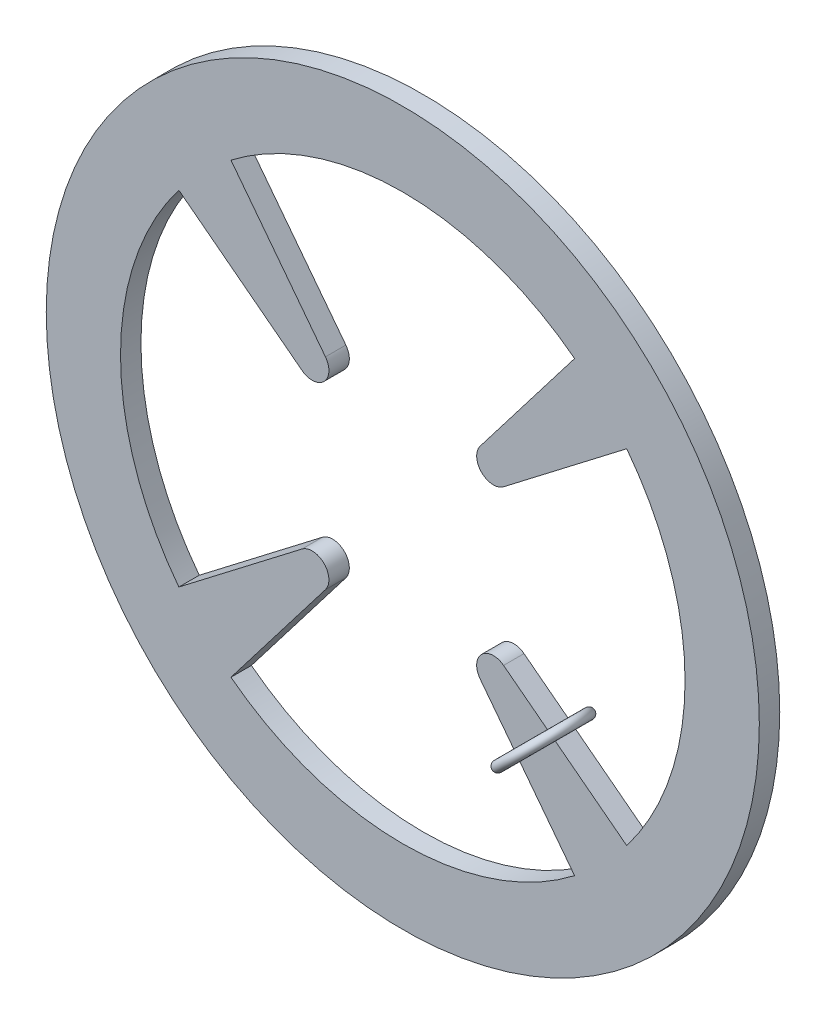
ISO-10303-21;
HEADER;
FILE_DESCRIPTION(('STEP AP214'),'2;1');
FILE_NAME('part.step','',(''),(''),'','','');
FILE_SCHEMA(('AUTOMOTIVE_DESIGN { 1 0 10303 214 1 1 1 1 }'));
ENDSEC;
DATA;
#1=APPLICATION_CONTEXT('core data for automotive mechanical design processes');
#2=APPLICATION_PROTOCOL_DEFINITION('international standard','automotive_design',2000,#1);
#3=PRODUCT_CONTEXT('',#1,'mechanical');
#4=PRODUCT('Part','Part','',(#3));
#5=PRODUCT_RELATED_PRODUCT_CATEGORY('part','',(#4));
#6=PRODUCT_DEFINITION_FORMATION('','',#4);
#7=PRODUCT_DEFINITION_CONTEXT('part definition',#1,'design');
#8=PRODUCT_DEFINITION('design','',#6,#7);
#9=PRODUCT_DEFINITION_SHAPE('','',#8);
#10=(LENGTH_UNIT() NAMED_UNIT(*) SI_UNIT(.MILLI.,.METRE.));
#11=(NAMED_UNIT(*) PLANE_ANGLE_UNIT() SI_UNIT($,.RADIAN.));
#12=(NAMED_UNIT(*) SI_UNIT($,.STERADIAN.) SOLID_ANGLE_UNIT());
#13=UNCERTAINTY_MEASURE_WITH_UNIT(LENGTH_MEASURE(1.E-05),#10,'distance_accuracy_value','');
#14=(GEOMETRIC_REPRESENTATION_CONTEXT(3) GLOBAL_UNCERTAINTY_ASSIGNED_CONTEXT((#13)) GLOBAL_UNIT_ASSIGNED_CONTEXT((#10,
#11,#12)) REPRESENTATION_CONTEXT('',''));
#15=CARTESIAN_POINT('',(0.,0.,0.));
#16=DIRECTION('',(0.,0.,1.));
#17=DIRECTION('',(1.,0.,0.));
#18=AXIS2_PLACEMENT_3D('',#15,#16,#17);
#19=CARTESIAN_POINT('',(0.353553390593274,-0.35355339059327,0.03));
#20=DIRECTION('',(0.707106781186549,-0.707106781186546,0.));
#21=DIRECTION('',(0.707106781186546,0.707106781186549,0.));
#22=AXIS2_PLACEMENT_3D('',#19,#20,#21);
#23=TOROIDAL_SURFACE('',#22,0.1,0.0132);
#24=CARTESIAN_POINT('',(0.424264068711928,-0.282842712474616,0.03));
#25=DIRECTION('',(0.,0.,1.));
#26=DIRECTION('',(1.,0.,0.));
#27=AXIS2_PLACEMENT_3D('',#24,#25,#26);
#28=CIRCLE('',#27,0.0132);
#29=CARTESIAN_POINT('',(0.433597878223591,-0.273508902962953,0.03));
#30=VERTEX_POINT('',#29);
#31=EDGE_CURVE('E11',#30,#30,#28,.T.);
#32=CARTESIAN_POINT('',(0.353553390593274,-0.35355339059327,0.03));
#33=DIRECTION('',(0.707106781186549,-0.707106781186546,0.));
#34=DIRECTION('',(0.707106781186546,0.707106781186549,0.));
#35=AXIS2_PLACEMENT_3D('',#32,#33,#34);
#36=CIRCLE('',#35,0.1132);
#37=EDGE_CURVE('',#30,#30,#36,.T.);
#38=ORIENTED_EDGE('',*,*,#31,.T.);
#39=ORIENTED_EDGE('',*,*,#31,.F.);
#40=ORIENTED_EDGE('',*,*,#37,.T.);
#41=ORIENTED_EDGE('',*,*,#37,.F.);
#42=EDGE_LOOP('',(#38,#40,#39,#41));
#43=FACE_BOUND('',#42,.T.);
#44=ADVANCED_FACE('F55',(#43),#23,.T.);
#45=CLOSED_SHELL('',(#44));
#46=MANIFOLD_SOLID_BREP('B2',#45);
#47=CARTESIAN_POINT('',(0.,0.,0.055));
#48=DIRECTION('',(0.,0.,-1.));
#49=DIRECTION('',(-1.,0.,0.));
#50=AXIS2_PLACEMENT_3D('',#47,#48,#49);
#51=CYLINDRICAL_SURFACE('',#50,0.76);
#52=CARTESIAN_POINT('',(0.,0.,0.));
#53=DIRECTION('',(0.,0.,1.));
#54=DIRECTION('',(1.,0.,0.));
#55=AXIS2_PLACEMENT_3D('',#52,#53,#54);
#56=CIRCLE('',#55,0.76);
#57=CARTESIAN_POINT('',(-0.462658686046631,-0.602948538621336,0.));
#58=VERTEX_POINT('',#57);
#59=CARTESIAN_POINT('',(0.462658686046628,-0.602948538621339,0.));
#60=VERTEX_POINT('',#59);
#61=EDGE_CURVE('E350',#58,#60,#56,.T.);
#62=ORIENTED_EDGE('',*,*,#61,.F.);
#63=DIRECTION('',(0.,0.,1.));
#64=VECTOR('',#63,1.);
#65=CARTESIAN_POINT('',(-0.462658686046631,-0.602948538621336,0.));
#66=LINE('',#65,#64);
#67=CARTESIAN_POINT('',(-0.462658686046631,-0.602948538621336,0.055));
#68=VERTEX_POINT('',#67);
#69=EDGE_CURVE('E90',#58,#68,#66,.T.);
#70=ORIENTED_EDGE('',*,*,#69,.T.);
#71=CARTESIAN_POINT('',(0.,0.,0.055));
#72=DIRECTION('',(0.,0.,1.));
#73=DIRECTION('',(1.,0.,0.));
#74=AXIS2_PLACEMENT_3D('',#71,#72,#73);
#75=CIRCLE('',#74,0.76);
#76=CARTESIAN_POINT('',(0.462658686046628,-0.602948538621339,0.055));
#77=VERTEX_POINT('',#76);
#78=EDGE_CURVE('E347',#68,#77,#75,.T.);
#79=ORIENTED_EDGE('',*,*,#78,.T.);
#80=DIRECTION('',(0.,0.,1.));
#81=VECTOR('',#80,1.);
#82=CARTESIAN_POINT('',(0.462658686046628,-0.602948538621339,0.));
#83=LINE('',#82,#81);
#84=EDGE_CURVE('E260',#60,#77,#83,.T.);
#85=ORIENTED_EDGE('',*,*,#84,.F.);
#86=EDGE_LOOP('',(#62,#70,#79,#85));
#87=FACE_BOUND('',#86,.T.);
#88=ADVANCED_FACE('F74',(#87),#51,.F.);
#89=CARTESIAN_POINT('',(0.602948538621336,-0.462658686046631,0.));
#90=VERTEX_POINT('',#89);
#91=CARTESIAN_POINT('',(0.602948538621339,0.462658686046628,0.));
#92=VERTEX_POINT('',#91);
#93=EDGE_CURVE('E354',#90,#92,#56,.T.);
#94=ORIENTED_EDGE('',*,*,#93,.F.);
#95=DIRECTION('',(0.,0.,1.));
#96=VECTOR('',#95,1.);
#97=CARTESIAN_POINT('',(0.602948538621336,-0.462658686046631,0.));
#98=LINE('',#97,#96);
#99=CARTESIAN_POINT('',(0.602948538621336,-0.462658686046631,0.055));
#100=VERTEX_POINT('',#99);
#101=EDGE_CURVE('E98',#90,#100,#98,.T.);
#102=ORIENTED_EDGE('',*,*,#101,.T.);
#103=CARTESIAN_POINT('',(0.602948538621339,0.462658686046628,0.055));
#104=VERTEX_POINT('',#103);
#105=EDGE_CURVE('E353',#100,#104,#75,.T.);
#106=ORIENTED_EDGE('',*,*,#105,.T.);
#107=DIRECTION('',(0.,0.,1.));
#108=VECTOR('',#107,1.);
#109=CARTESIAN_POINT('',(0.602948538621339,0.462658686046628,0.));
#110=LINE('',#109,#108);
#111=EDGE_CURVE('E297',#92,#104,#110,.T.);
#112=ORIENTED_EDGE('',*,*,#111,.F.);
#113=EDGE_LOOP('',(#94,#102,#106,#112));
#114=FACE_BOUND('',#113,.T.);
#115=ADVANCED_FACE('F369',(#114),#51,.F.);
#116=CARTESIAN_POINT('',(0.462658686046631,0.602948538621336,0.));
#117=VERTEX_POINT('',#116);
#118=CARTESIAN_POINT('',(-0.462658686046628,0.602948538621339,0.));
#119=VERTEX_POINT('',#118);
#120=EDGE_CURVE('E333',#117,#119,#56,.T.);
#121=ORIENTED_EDGE('',*,*,#120,.F.);
#122=DIRECTION('',(0.,0.,1.));
#123=VECTOR('',#122,1.);
#124=CARTESIAN_POINT('',(0.462658686046631,0.602948538621336,0.));
#125=LINE('',#124,#123);
#126=CARTESIAN_POINT('',(0.462658686046631,0.602948538621336,0.055));
#127=VERTEX_POINT('',#126);
#128=EDGE_CURVE('E292',#117,#127,#125,.T.);
#129=ORIENTED_EDGE('',*,*,#128,.T.);
#130=CARTESIAN_POINT('',(-0.462658686046628,0.602948538621339,0.055));
#131=VERTEX_POINT('',#130);
#132=EDGE_CURVE('E348',#127,#131,#75,.T.);
#133=ORIENTED_EDGE('',*,*,#132,.T.);
#134=DIRECTION('',(0.,0.,1.));
#135=VECTOR('',#134,1.);
#136=CARTESIAN_POINT('',(-0.462658686046628,0.602948538621339,0.));
#137=LINE('',#136,#135);
#138=EDGE_CURVE('E334',#119,#131,#137,.T.);
#139=ORIENTED_EDGE('',*,*,#138,.F.);
#140=EDGE_LOOP('',(#121,#129,#133,#139));
#141=FACE_BOUND('',#140,.T.);
#142=ADVANCED_FACE('F407',(#141),#51,.F.);
#143=DIRECTION('',(0.,0.,1.));
#144=VECTOR('',#143,1.);
#145=CARTESIAN_POINT('',(-0.602948538621339,-0.462658686046628,0.));
#146=LINE('',#145,#144);
#147=CARTESIAN_POINT('',(-0.602948538621339,-0.462658686046628,0.));
#148=VERTEX_POINT('',#147);
#149=CARTESIAN_POINT('',(-0.602948538621339,-0.462658686046628,0.055));
#150=VERTEX_POINT('',#149);
#151=EDGE_CURVE('E201',#148,#150,#146,.T.);
#152=ORIENTED_EDGE('',*,*,#151,.F.);
#153=CARTESIAN_POINT('',(-0.602948538621336,0.462658686046631,0.));
#154=VERTEX_POINT('',#153);
#155=EDGE_CURVE('E210',#154,#148,#56,.T.);
#156=ORIENTED_EDGE('',*,*,#155,.F.);
#157=DIRECTION('',(0.,0.,1.));
#158=VECTOR('',#157,1.);
#159=CARTESIAN_POINT('',(-0.602948538621336,0.462658686046631,0.));
#160=LINE('',#159,#158);
#161=CARTESIAN_POINT('',(-0.602948538621336,0.462658686046631,0.055));
#162=VERTEX_POINT('',#161);
#163=EDGE_CURVE('E329',#154,#162,#160,.T.);
#164=ORIENTED_EDGE('',*,*,#163,.T.);
#165=EDGE_CURVE('E343',#162,#150,#75,.T.);
#166=ORIENTED_EDGE('',*,*,#165,.T.);
#167=EDGE_LOOP('',(#152,#156,#164,#166));
#168=FACE_BOUND('',#167,.T.);
#169=ADVANCED_FACE('F391',(#168),#51,.F.);
#170=CARTESIAN_POINT('',(0.,0.,0.055));
#171=DIRECTION('',(0.,0.,1.));
#172=DIRECTION('',(1.,0.,0.));
#173=AXIS2_PLACEMENT_3D('',#170,#171,#172);
#174=PLANE('',#173);
#175=CARTESIAN_POINT('',(0.,0.,0.055));
#176=DIRECTION('',(0.,0.,1.));
#177=DIRECTION('',(1.,0.,0.));
#178=AXIS2_PLACEMENT_3D('',#175,#176,#177);
#179=CIRCLE('',#178,0.96);
#180=CARTESIAN_POINT('',(0.96,0.,0.055));
#181=VERTEX_POINT('',#180);
#182=EDGE_CURVE('E53',#181,#181,#179,.T.);
#183=ORIENTED_EDGE('',*,*,#182,.T.);
#184=EDGE_LOOP('',(#183));
#185=FACE_BOUND('',#184,.T.);
#186=ORIENTED_EDGE('',*,*,#165,.F.);
#187=DIRECTION('',(-0.793353340291235,0.60876142900872,0.));
#188=VECTOR('',#187,1.);
#189=CARTESIAN_POINT('',(0.,0.,0.055));
#190=LINE('',#189,#188);
#191=CARTESIAN_POINT('',(-0.271393831112811,0.208247810983869,0.055));
#192=VERTEX_POINT('',#191);
#193=EDGE_CURVE('E296',#192,#162,#190,.T.);
#194=ORIENTED_EDGE('',*,*,#193,.F.);
#195=CARTESIAN_POINT('',(-0.243977486679677,0.243977486679683,0.055));
#196=DIRECTION('',(0.,0.,1.));
#197=DIRECTION('',(1.,0.,0.));
#198=AXIS2_PLACEMENT_3D('',#195,#196,#197);
#199=CIRCLE('',#198,0.0450362705761065);
#200=CARTESIAN_POINT('',(-0.208247810983862,0.271393831112816,0.055));
#201=VERTEX_POINT('',#200);
#202=EDGE_CURVE('E322',#192,#201,#199,.T.);
#203=ORIENTED_EDGE('',*,*,#202,.T.);
#204=DIRECTION('',(-0.608761429008729,0.793353340291229,0.));
#205=VECTOR('',#204,1.);
#206=CARTESIAN_POINT('',(0.,0.,0.055));
#207=LINE('',#206,#205);
#208=EDGE_CURVE('E310',#201,#131,#207,.T.);
#209=ORIENTED_EDGE('',*,*,#208,.T.);
#210=ORIENTED_EDGE('',*,*,#132,.F.);
#211=DIRECTION('',(0.608761429008728,0.79335334029123,0.));
#212=VECTOR('',#211,1.);
#213=CARTESIAN_POINT('',(0.,0.,0.055));
#214=LINE('',#213,#212);
#215=CARTESIAN_POINT('',(0.208247810983866,0.271393831112813,0.055));
#216=VERTEX_POINT('',#215);
#217=EDGE_CURVE('E259',#216,#127,#214,.T.);
#218=ORIENTED_EDGE('',*,*,#217,.F.);
#219=CARTESIAN_POINT('',(0.24397748667968,0.243977486679679,0.055));
#220=DIRECTION('',(0.,0.,1.));
#221=DIRECTION('',(1.,0.,0.));
#222=AXIS2_PLACEMENT_3D('',#219,#220,#221);
#223=CIRCLE('',#222,0.0450362705761065);
#224=CARTESIAN_POINT('',(0.271393831112814,0.208247810983865,0.055));
#225=VERTEX_POINT('',#224);
#226=EDGE_CURVE('E285',#216,#225,#223,.T.);
#227=ORIENTED_EDGE('',*,*,#226,.T.);
#228=DIRECTION('',(0.793353340291234,0.608761429008722,0.));
#229=VECTOR('',#228,1.);
#230=CARTESIAN_POINT('',(0.,0.,0.055));
#231=LINE('',#230,#229);
#232=EDGE_CURVE('E274',#225,#104,#231,.T.);
#233=ORIENTED_EDGE('',*,*,#232,.T.);
#234=ORIENTED_EDGE('',*,*,#105,.F.);
#235=DIRECTION('',(0.793353340291232,-0.608761429008725,0.));
#236=VECTOR('',#235,1.);
#237=CARTESIAN_POINT('',(0.,0.,0.055));
#238=LINE('',#237,#236);
#239=CARTESIAN_POINT('',(0.271393831112813,-0.208247810983867,0.055));
#240=VERTEX_POINT('',#239);
#241=EDGE_CURVE('E230',#240,#100,#238,.T.);
#242=ORIENTED_EDGE('',*,*,#241,.F.);
#243=CARTESIAN_POINT('',(0.243977486679678,-0.243977486679681,0.055));
#244=DIRECTION('',(0.,0.,1.));
#245=DIRECTION('',(1.,0.,0.));
#246=AXIS2_PLACEMENT_3D('',#243,#244,#245);
#247=CIRCLE('',#246,0.0450362705761065);
#248=CARTESIAN_POINT('',(0.208247810983864,-0.271393831112815,0.055));
#249=VERTEX_POINT('',#248);
#250=EDGE_CURVE('E250',#240,#249,#247,.T.);
#251=ORIENTED_EDGE('',*,*,#250,.T.);
#252=DIRECTION('',(0.608761429008724,-0.793353340291233,0.));
#253=VECTOR('',#252,1.);
#254=CARTESIAN_POINT('',(0.,0.,0.055));
#255=LINE('',#254,#253);
#256=EDGE_CURVE('E239',#249,#77,#255,.T.);
#257=ORIENTED_EDGE('',*,*,#256,.T.);
#258=ORIENTED_EDGE('',*,*,#78,.F.);
#259=DIRECTION('',(-0.608761429008723,-0.793353340291233,0.));
#260=VECTOR('',#259,1.);
#261=CARTESIAN_POINT('',(0.,0.,0.055));
#262=LINE('',#261,#260);
#263=CARTESIAN_POINT('',(-0.208247810983868,-0.271393831112812,0.055));
#264=VERTEX_POINT('',#263);
#265=EDGE_CURVE('E216',#264,#68,#262,.T.);
#266=ORIENTED_EDGE('',*,*,#265,.F.);
#267=CARTESIAN_POINT('',(-0.243977486679682,-0.243977486679678,0.055));
#268=DIRECTION('',(0.,0.,1.));
#269=DIRECTION('',(1.,0.,0.));
#270=AXIS2_PLACEMENT_3D('',#267,#268,#269);
#271=CIRCLE('',#270,0.0450362705761065);
#272=CARTESIAN_POINT('',(-0.271393831112815,-0.208247810983863,0.055));
#273=VERTEX_POINT('',#272);
#274=EDGE_CURVE('E223',#264,#273,#271,.T.);
#275=ORIENTED_EDGE('',*,*,#274,.T.);
#276=DIRECTION('',(-0.793353340291231,-0.608761429008727,0.));
#277=VECTOR('',#276,1.);
#278=CARTESIAN_POINT('',(0.,0.,0.055));
#279=LINE('',#278,#277);
#280=EDGE_CURVE('E195',#273,#150,#279,.T.);
#281=ORIENTED_EDGE('',*,*,#280,.T.);
#282=EDGE_LOOP('',(#186,#194,#203,#209,#210,#218,#227,#233,#234,#242,#251,#257,#258,#266,#275,#281));
#283=FACE_BOUND('',#282,.T.);
#284=ADVANCED_FACE('F384',(#185,#283),#174,.T.);
#285=CARTESIAN_POINT('',(0.,0.,0.));
#286=DIRECTION('',(0.,0.,1.));
#287=DIRECTION('',(1.,0.,0.));
#288=AXIS2_PLACEMENT_3D('',#285,#286,#287);
#289=PLANE('',#288);
#290=CARTESIAN_POINT('',(0.,0.,0.));
#291=DIRECTION('',(0.,0.,1.));
#292=DIRECTION('',(1.,0.,0.));
#293=AXIS2_PLACEMENT_3D('',#290,#291,#292);
#294=CIRCLE('',#293,0.96);
#295=CARTESIAN_POINT('',(0.96,0.,0.));
#296=VERTEX_POINT('',#295);
#297=EDGE_CURVE('E78',#296,#296,#294,.T.);
#298=ORIENTED_EDGE('',*,*,#297,.F.);
#299=EDGE_LOOP('',(#298));
#300=FACE_BOUND('',#299,.T.);
#301=ORIENTED_EDGE('',*,*,#155,.T.);
#302=DIRECTION('',(-0.793353340291231,-0.608761429008727,0.));
#303=VECTOR('',#302,1.);
#304=CARTESIAN_POINT('',(0.,0.,0.));
#305=LINE('',#304,#303);
#306=CARTESIAN_POINT('',(-0.271393831112815,-0.208247810983863,0.));
#307=VERTEX_POINT('',#306);
#308=EDGE_CURVE('E192',#307,#148,#305,.T.);
#309=ORIENTED_EDGE('',*,*,#308,.F.);
#310=CARTESIAN_POINT('',(-0.243977486679682,-0.243977486679678,0.));
#311=DIRECTION('',(0.,0.,1.));
#312=DIRECTION('',(1.,0.,0.));
#313=AXIS2_PLACEMENT_3D('',#310,#311,#312);
#314=CIRCLE('',#313,0.0450362705761065);
#315=CARTESIAN_POINT('',(-0.208247810983868,-0.271393831112812,0.));
#316=VERTEX_POINT('',#315);
#317=EDGE_CURVE('E208',#316,#307,#314,.T.);
#318=ORIENTED_EDGE('',*,*,#317,.F.);
#319=DIRECTION('',(-0.608761429008723,-0.793353340291233,0.));
#320=VECTOR('',#319,1.);
#321=CARTESIAN_POINT('',(0.,0.,0.));
#322=LINE('',#321,#320);
#323=EDGE_CURVE('E202',#316,#58,#322,.T.);
#324=ORIENTED_EDGE('',*,*,#323,.T.);
#325=ORIENTED_EDGE('',*,*,#61,.T.);
#326=DIRECTION('',(0.608761429008724,-0.793353340291233,0.));
#327=VECTOR('',#326,1.);
#328=CARTESIAN_POINT('',(0.,0.,0.));
#329=LINE('',#328,#327);
#330=CARTESIAN_POINT('',(0.208247810983864,-0.271393831112815,0.));
#331=VERTEX_POINT('',#330);
#332=EDGE_CURVE('E243',#331,#60,#329,.T.);
#333=ORIENTED_EDGE('',*,*,#332,.F.);
#334=CARTESIAN_POINT('',(0.243977486679678,-0.243977486679681,0.));
#335=DIRECTION('',(0.,0.,1.));
#336=DIRECTION('',(1.,0.,0.));
#337=AXIS2_PLACEMENT_3D('',#334,#335,#336);
#338=CIRCLE('',#337,0.0450362705761065);
#339=CARTESIAN_POINT('',(0.271393831112813,-0.208247810983867,0.));
#340=VERTEX_POINT('',#339);
#341=EDGE_CURVE('E238',#340,#331,#338,.T.);
#342=ORIENTED_EDGE('',*,*,#341,.F.);
#343=DIRECTION('',(0.793353340291232,-0.608761429008725,0.));
#344=VECTOR('',#343,1.);
#345=CARTESIAN_POINT('',(0.,0.,0.));
#346=LINE('',#345,#344);
#347=EDGE_CURVE('E235',#340,#90,#346,.T.);
#348=ORIENTED_EDGE('',*,*,#347,.T.);
#349=ORIENTED_EDGE('',*,*,#93,.T.);
#350=DIRECTION('',(0.793353340291234,0.608761429008722,0.));
#351=VECTOR('',#350,1.);
#352=CARTESIAN_POINT('',(0.,0.,0.));
#353=LINE('',#352,#351);
#354=CARTESIAN_POINT('',(0.271393831112814,0.208247810983865,0.));
#355=VERTEX_POINT('',#354);
#356=EDGE_CURVE('E278',#355,#92,#353,.T.);
#357=ORIENTED_EDGE('',*,*,#356,.F.);
#358=CARTESIAN_POINT('',(0.24397748667968,0.243977486679679,0.));
#359=DIRECTION('',(0.,0.,1.));
#360=DIRECTION('',(1.,0.,0.));
#361=AXIS2_PLACEMENT_3D('',#358,#359,#360);
#362=CIRCLE('',#361,0.0450362705761065);
#363=CARTESIAN_POINT('',(0.208247810983866,0.271393831112813,0.));
#364=VERTEX_POINT('',#363);
#365=EDGE_CURVE('E273',#364,#355,#362,.T.);
#366=ORIENTED_EDGE('',*,*,#365,.F.);
#367=DIRECTION('',(0.608761429008728,0.79335334029123,0.));
#368=VECTOR('',#367,1.);
#369=CARTESIAN_POINT('',(0.,0.,0.));
#370=LINE('',#369,#368);
#371=EDGE_CURVE('E269',#364,#117,#370,.T.);
#372=ORIENTED_EDGE('',*,*,#371,.T.);
#373=ORIENTED_EDGE('',*,*,#120,.T.);
#374=DIRECTION('',(-0.608761429008729,0.793353340291229,0.));
#375=VECTOR('',#374,1.);
#376=CARTESIAN_POINT('',(0.,0.,0.));
#377=LINE('',#376,#375);
#378=CARTESIAN_POINT('',(-0.208247810983862,0.271393831112816,0.));
#379=VERTEX_POINT('',#378);
#380=EDGE_CURVE('E314',#379,#119,#377,.T.);
#381=ORIENTED_EDGE('',*,*,#380,.F.);
#382=CARTESIAN_POINT('',(-0.243977486679677,0.243977486679683,0.));
#383=DIRECTION('',(0.,0.,1.));
#384=DIRECTION('',(1.,0.,0.));
#385=AXIS2_PLACEMENT_3D('',#382,#383,#384);
#386=CIRCLE('',#385,0.0450362705761065);
#387=CARTESIAN_POINT('',(-0.271393831112811,0.208247810983869,0.));
#388=VERTEX_POINT('',#387);
#389=EDGE_CURVE('E309',#388,#379,#386,.T.);
#390=ORIENTED_EDGE('',*,*,#389,.F.);
#391=DIRECTION('',(-0.793353340291235,0.60876142900872,0.));
#392=VECTOR('',#391,1.);
#393=CARTESIAN_POINT('',(0.,0.,0.));
#394=LINE('',#393,#392);
#395=EDGE_CURVE('E306',#388,#154,#394,.T.);
#396=ORIENTED_EDGE('',*,*,#395,.T.);
#397=EDGE_LOOP('',(#301,#309,#318,#324,#325,#333,#342,#348,#349,#357,#366,#372,#373,#381,#390,#396));
#398=FACE_BOUND('',#397,.T.);
#399=ADVANCED_FACE('F207',(#300,#398),#289,.F.);
#400=CARTESIAN_POINT('',(0.,0.,0.055));
#401=DIRECTION('',(0.,0.,-1.));
#402=DIRECTION('',(-1.,0.,0.));
#403=AXIS2_PLACEMENT_3D('',#400,#401,#402);
#404=CYLINDRICAL_SURFACE('',#403,0.96);
#405=ORIENTED_EDGE('',*,*,#182,.F.);
#406=EDGE_LOOP('',(#405));
#407=FACE_BOUND('',#406,.T.);
#408=ORIENTED_EDGE('',*,*,#297,.T.);
#409=EDGE_LOOP('',(#408));
#410=FACE_BOUND('',#409,.T.);
#411=ADVANCED_FACE('F76',(#407,#410),#404,.T.);
#412=CARTESIAN_POINT('',(0.,0.,0.));
#413=DIRECTION('',(0.60876142900872,0.793353340291235,0.));
#414=DIRECTION('',(-0.793353340291235,0.60876142900872,0.));
#415=AXIS2_PLACEMENT_3D('',#412,#413,#414);
#416=PLANE('',#415);
#417=ORIENTED_EDGE('',*,*,#193,.T.);
#418=ORIENTED_EDGE('',*,*,#163,.F.);
#419=ORIENTED_EDGE('',*,*,#395,.F.);
#420=DIRECTION('',(0.,0.,1.));
#421=VECTOR('',#420,1.);
#422=CARTESIAN_POINT('',(-0.271393831112811,0.208247810983869,0.));
#423=LINE('',#422,#421);
#424=EDGE_CURVE('E318',#388,#192,#423,.T.);
#425=ORIENTED_EDGE('',*,*,#424,.T.);
#426=EDGE_LOOP('',(#417,#418,#419,#425));
#427=FACE_BOUND('',#426,.T.);
#428=ADVANCED_FACE('F395',(#427),#416,.F.);
#429=CARTESIAN_POINT('',(0.,0.,0.));
#430=DIRECTION('',(0.793353340291229,0.608761429008729,0.));
#431=DIRECTION('',(-0.608761429008729,0.793353340291229,0.));
#432=AXIS2_PLACEMENT_3D('',#429,#430,#431);
#433=PLANE('',#432);
#434=ORIENTED_EDGE('',*,*,#208,.F.);
#435=DIRECTION('',(0.,0.,1.));
#436=VECTOR('',#435,1.);
#437=CARTESIAN_POINT('',(-0.208247810983862,0.271393831112816,0.));
#438=LINE('',#437,#436);
#439=EDGE_CURVE('E338',#379,#201,#438,.T.);
#440=ORIENTED_EDGE('',*,*,#439,.F.);
#441=ORIENTED_EDGE('',*,*,#380,.T.);
#442=ORIENTED_EDGE('',*,*,#138,.T.);
#443=EDGE_LOOP('',(#434,#440,#441,#442));
#444=FACE_BOUND('',#443,.T.);
#445=ADVANCED_FACE('F402',(#444),#433,.T.);
#446=CARTESIAN_POINT('',(-0.243977486679677,0.243977486679683,0.));
#447=DIRECTION('',(0.,0.,1.));
#448=DIRECTION('',(1.,0.,0.));
#449=AXIS2_PLACEMENT_3D('',#446,#447,#448);
#450=CYLINDRICAL_SURFACE('',#449,0.0450362705761065);
#451=ORIENTED_EDGE('',*,*,#202,.F.);
#452=ORIENTED_EDGE('',*,*,#424,.F.);
#453=ORIENTED_EDGE('',*,*,#389,.T.);
#454=ORIENTED_EDGE('',*,*,#439,.T.);
#455=EDGE_LOOP('',(#451,#452,#453,#454));
#456=FACE_BOUND('',#455,.T.);
#457=ADVANCED_FACE('F398',(#456),#450,.T.);
#458=CARTESIAN_POINT('',(0.,0.,0.));
#459=DIRECTION('',(0.79335334029123,-0.608761429008728,0.));
#460=DIRECTION('',(0.608761429008728,0.79335334029123,0.));
#461=AXIS2_PLACEMENT_3D('',#458,#459,#460);
#462=PLANE('',#461);
#463=ORIENTED_EDGE('',*,*,#217,.T.);
#464=ORIENTED_EDGE('',*,*,#128,.F.);
#465=ORIENTED_EDGE('',*,*,#371,.F.);
#466=DIRECTION('',(0.,0.,1.));
#467=VECTOR('',#466,1.);
#468=CARTESIAN_POINT('',(0.208247810983866,0.271393831112813,0.));
#469=LINE('',#468,#467);
#470=EDGE_CURVE('E282',#364,#216,#469,.T.);
#471=ORIENTED_EDGE('',*,*,#470,.T.);
#472=EDGE_LOOP('',(#463,#464,#465,#471));
#473=FACE_BOUND('',#472,.T.);
#474=ADVANCED_FACE('F410',(#473),#462,.F.);
#475=CARTESIAN_POINT('',(0.,0.,0.));
#476=DIRECTION('',(0.608761429008722,-0.793353340291234,0.));
#477=DIRECTION('',(0.793353340291234,0.608761429008722,0.));
#478=AXIS2_PLACEMENT_3D('',#475,#476,#477);
#479=PLANE('',#478);
#480=ORIENTED_EDGE('',*,*,#232,.F.);
#481=DIRECTION('',(0.,0.,1.));
#482=VECTOR('',#481,1.);
#483=CARTESIAN_POINT('',(0.271393831112814,0.208247810983865,0.));
#484=LINE('',#483,#482);
#485=EDGE_CURVE('E301',#355,#225,#484,.T.);
#486=ORIENTED_EDGE('',*,*,#485,.F.);
#487=ORIENTED_EDGE('',*,*,#356,.T.);
#488=ORIENTED_EDGE('',*,*,#111,.T.);
#489=EDGE_LOOP('',(#480,#486,#487,#488));
#490=FACE_BOUND('',#489,.T.);
#491=ADVANCED_FACE('F368',(#490),#479,.T.);
#492=CARTESIAN_POINT('',(0.24397748667968,0.243977486679679,0.));
#493=DIRECTION('',(0.,0.,1.));
#494=DIRECTION('',(1.,0.,0.));
#495=AXIS2_PLACEMENT_3D('',#492,#493,#494);
#496=CYLINDRICAL_SURFACE('',#495,0.0450362705761065);
#497=ORIENTED_EDGE('',*,*,#226,.F.);
#498=ORIENTED_EDGE('',*,*,#470,.F.);
#499=ORIENTED_EDGE('',*,*,#365,.T.);
#500=ORIENTED_EDGE('',*,*,#485,.T.);
#501=EDGE_LOOP('',(#497,#498,#499,#500));
#502=FACE_BOUND('',#501,.T.);
#503=ADVANCED_FACE('F412',(#502),#496,.T.);
#504=CARTESIAN_POINT('',(0.,0.,0.));
#505=DIRECTION('',(-0.608761429008725,-0.793353340291232,0.));
#506=DIRECTION('',(0.793353340291232,-0.608761429008725,0.));
#507=AXIS2_PLACEMENT_3D('',#504,#505,#506);
#508=PLANE('',#507);
#509=ORIENTED_EDGE('',*,*,#241,.T.);
#510=ORIENTED_EDGE('',*,*,#101,.F.);
#511=ORIENTED_EDGE('',*,*,#347,.F.);
#512=DIRECTION('',(0.,0.,1.));
#513=VECTOR('',#512,1.);
#514=CARTESIAN_POINT('',(0.271393831112813,-0.208247810983867,0.));
#515=LINE('',#514,#513);
#516=EDGE_CURVE('E247',#340,#240,#515,.T.);
#517=ORIENTED_EDGE('',*,*,#516,.T.);
#518=EDGE_LOOP('',(#509,#510,#511,#517));
#519=FACE_BOUND('',#518,.T.);
#520=ADVANCED_FACE('F414',(#519),#508,.F.);
#521=CARTESIAN_POINT('',(0.,0.,0.));
#522=DIRECTION('',(-0.793353340291233,-0.608761429008724,0.));
#523=DIRECTION('',(0.608761429008724,-0.793353340291233,0.));
#524=AXIS2_PLACEMENT_3D('',#521,#522,#523);
#525=PLANE('',#524);
#526=ORIENTED_EDGE('',*,*,#256,.F.);
#527=DIRECTION('',(0.,0.,1.));
#528=VECTOR('',#527,1.);
#529=CARTESIAN_POINT('',(0.208247810983864,-0.271393831112815,0.));
#530=LINE('',#529,#528);
#531=EDGE_CURVE('E264',#331,#249,#530,.T.);
#532=ORIENTED_EDGE('',*,*,#531,.F.);
#533=ORIENTED_EDGE('',*,*,#332,.T.);
#534=ORIENTED_EDGE('',*,*,#84,.T.);
#535=EDGE_LOOP('',(#526,#532,#533,#534));
#536=FACE_BOUND('',#535,.T.);
#537=ADVANCED_FACE('F382',(#536),#525,.T.);
#538=CARTESIAN_POINT('',(0.243977486679678,-0.243977486679681,0.));
#539=DIRECTION('',(0.,0.,1.));
#540=DIRECTION('',(1.,0.,0.));
#541=AXIS2_PLACEMENT_3D('',#538,#539,#540);
#542=CYLINDRICAL_SURFACE('',#541,0.0450362705761065);
#543=ORIENTED_EDGE('',*,*,#250,.F.);
#544=ORIENTED_EDGE('',*,*,#516,.F.);
#545=ORIENTED_EDGE('',*,*,#341,.T.);
#546=ORIENTED_EDGE('',*,*,#531,.T.);
#547=EDGE_LOOP('',(#543,#544,#545,#546));
#548=FACE_BOUND('',#547,.T.);
#549=ADVANCED_FACE('F387',(#548),#542,.T.);
#550=CARTESIAN_POINT('',(-0.243977486679682,-0.243977486679678,0.));
#551=DIRECTION('',(0.,0.,1.));
#552=DIRECTION('',(1.,0.,0.));
#553=AXIS2_PLACEMENT_3D('',#550,#551,#552);
#554=CYLINDRICAL_SURFACE('',#553,0.0450362705761065);
#555=ORIENTED_EDGE('',*,*,#274,.F.);
#556=DIRECTION('',(0.,0.,1.));
#557=VECTOR('',#556,1.);
#558=CARTESIAN_POINT('',(-0.208247810983868,-0.271393831112812,0.));
#559=LINE('',#558,#557);
#560=EDGE_CURVE('E214',#316,#264,#559,.T.);
#561=ORIENTED_EDGE('',*,*,#560,.F.);
#562=ORIENTED_EDGE('',*,*,#317,.T.);
#563=DIRECTION('',(0.,0.,1.));
#564=VECTOR('',#563,1.);
#565=CARTESIAN_POINT('',(-0.271393831112815,-0.208247810983863,0.));
#566=LINE('',#565,#564);
#567=EDGE_CURVE('E189',#307,#273,#566,.T.);
#568=ORIENTED_EDGE('',*,*,#567,.T.);
#569=EDGE_LOOP('',(#555,#561,#562,#568));
#570=FACE_BOUND('',#569,.T.);
#571=ADVANCED_FACE('F213',(#570),#554,.T.);
#572=CARTESIAN_POINT('',(0.,0.,0.));
#573=DIRECTION('',(-0.793353340291233,0.608761429008723,0.));
#574=DIRECTION('',(-0.608761429008723,-0.793353340291233,0.));
#575=AXIS2_PLACEMENT_3D('',#572,#573,#574);
#576=PLANE('',#575);
#577=ORIENTED_EDGE('',*,*,#265,.T.);
#578=ORIENTED_EDGE('',*,*,#69,.F.);
#579=ORIENTED_EDGE('',*,*,#323,.F.);
#580=ORIENTED_EDGE('',*,*,#560,.T.);
#581=EDGE_LOOP('',(#577,#578,#579,#580));
#582=FACE_BOUND('',#581,.T.);
#583=ADVANCED_FACE('F388',(#582),#576,.F.);
#584=CARTESIAN_POINT('',(0.,0.,0.));
#585=DIRECTION('',(-0.608761429008727,0.793353340291231,0.));
#586=DIRECTION('',(-0.793353340291231,-0.608761429008727,0.));
#587=AXIS2_PLACEMENT_3D('',#584,#585,#586);
#588=PLANE('',#587);
#589=ORIENTED_EDGE('',*,*,#280,.F.);
#590=ORIENTED_EDGE('',*,*,#567,.F.);
#591=ORIENTED_EDGE('',*,*,#308,.T.);
#592=ORIENTED_EDGE('',*,*,#151,.T.);
#593=EDGE_LOOP('',(#589,#590,#591,#592));
#594=FACE_BOUND('',#593,.T.);
#595=ADVANCED_FACE('F191',(#594),#588,.T.);
#596=CLOSED_SHELL('',(#88,#115,#142,#169,#284,#399,#411,#428,#445,#457,#474,#491,#503,#520,#537,
#549,#571,#583,#595));
#597=MANIFOLD_SOLID_BREP('B6',#596);
#598=ADVANCED_BREP_SHAPE_REPRESENTATION('',(#18,#46,#597),#14);
#599=SHAPE_DEFINITION_REPRESENTATION(#9,#598);
ENDSEC;
END-ISO-10303-21;
